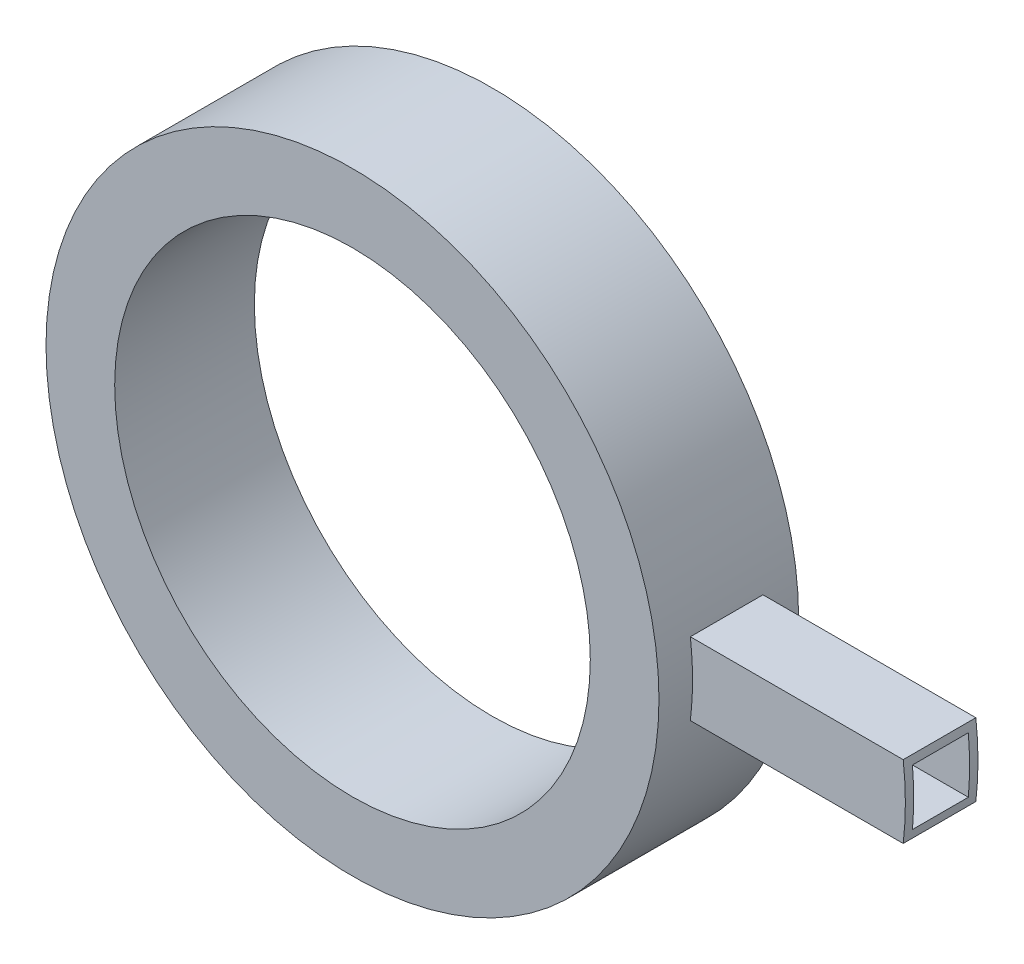
ISO-10303-21;
HEADER;
FILE_DESCRIPTION(('STEP AP214'),'2;1');
FILE_NAME('part.step','',(''),(''),'','','');
FILE_SCHEMA(('AUTOMOTIVE_DESIGN { 1 0 10303 214 1 1 1 1 }'));
ENDSEC;
DATA;
#1=APPLICATION_CONTEXT('core data for automotive mechanical design processes');
#2=APPLICATION_PROTOCOL_DEFINITION('international standard','automotive_design',2000,#1);
#3=PRODUCT_CONTEXT('',#1,'mechanical');
#4=PRODUCT('Part','Part','',(#3));
#5=PRODUCT_RELATED_PRODUCT_CATEGORY('part','',(#4));
#6=PRODUCT_DEFINITION_FORMATION('','',#4);
#7=PRODUCT_DEFINITION_CONTEXT('part definition',#1,'design');
#8=PRODUCT_DEFINITION('design','',#6,#7);
#9=PRODUCT_DEFINITION_SHAPE('','',#8);
#10=(LENGTH_UNIT() NAMED_UNIT(*) SI_UNIT(.MILLI.,.METRE.));
#11=(NAMED_UNIT(*) PLANE_ANGLE_UNIT() SI_UNIT($,.RADIAN.));
#12=(NAMED_UNIT(*) SI_UNIT($,.STERADIAN.) SOLID_ANGLE_UNIT());
#13=UNCERTAINTY_MEASURE_WITH_UNIT(LENGTH_MEASURE(1.E-05),#10,'distance_accuracy_value','');
#14=(GEOMETRIC_REPRESENTATION_CONTEXT(3) GLOBAL_UNCERTAINTY_ASSIGNED_CONTEXT((#13)) GLOBAL_UNIT_ASSIGNED_CONTEXT((#10,
#11,#12)) REPRESENTATION_CONTEXT('',''));
#15=CARTESIAN_POINT('',(0.,0.,0.));
#16=DIRECTION('',(0.,0.,1.));
#17=DIRECTION('',(1.,0.,0.));
#18=AXIS2_PLACEMENT_3D('',#15,#16,#17);
#19=CARTESIAN_POINT('',(0.,0.,50.));
#20=DIRECTION('',(0.,0.,1.));
#21=DIRECTION('',(1.,0.,0.));
#22=AXIS2_PLACEMENT_3D('',#19,#20,#21);
#23=PLANE('',#22);
#24=CARTESIAN_POINT('',(0.,0.,50.));
#25=DIRECTION('',(0.,0.,1.));
#26=DIRECTION('',(1.,0.,0.));
#27=AXIS2_PLACEMENT_3D('',#24,#25,#26);
#28=CIRCLE('',#27,109.714317710566);
#29=CARTESIAN_POINT('',(109.714317710566,0.,50.));
#30=VERTEX_POINT('',#29);
#31=EDGE_CURVE('E11',#30,#30,#28,.T.);
#32=ORIENTED_EDGE('',*,*,#31,.T.);
#33=EDGE_LOOP('',(#32));
#34=FACE_BOUND('',#33,.T.);
#35=CARTESIAN_POINT('',(0.,0.,50.));
#36=DIRECTION('',(0.,0.,1.));
#37=DIRECTION('',(1.,0.,0.));
#38=AXIS2_PLACEMENT_3D('',#35,#36,#37);
#39=CIRCLE('',#38,85.130943159236);
#40=CARTESIAN_POINT('',(85.130943159236,0.,50.));
#41=VERTEX_POINT('',#40);
#42=EDGE_CURVE('E167',#41,#41,#39,.T.);
#43=ORIENTED_EDGE('',*,*,#42,.F.);
#44=EDGE_LOOP('',(#43));
#45=FACE_BOUND('',#44,.T.);
#46=ADVANCED_FACE('F33',(#34,#45),#23,.T.);
#47=CARTESIAN_POINT('',(0.,0.,0.));
#48=DIRECTION('',(0.,0.,1.));
#49=DIRECTION('',(1.,0.,0.));
#50=AXIS2_PLACEMENT_3D('',#47,#48,#49);
#51=PLANE('',#50);
#52=CARTESIAN_POINT('',(0.,0.,0.));
#53=DIRECTION('',(0.,0.,1.));
#54=DIRECTION('',(1.,0.,0.));
#55=AXIS2_PLACEMENT_3D('',#52,#53,#54);
#56=CIRCLE('',#55,109.714317710566);
#57=CARTESIAN_POINT('',(109.714317710566,0.,0.));
#58=VERTEX_POINT('',#57);
#59=EDGE_CURVE('E37',#58,#58,#56,.T.);
#60=ORIENTED_EDGE('',*,*,#59,.F.);
#61=EDGE_LOOP('',(#60));
#62=FACE_BOUND('',#61,.T.);
#63=CARTESIAN_POINT('',(0.,0.,0.));
#64=DIRECTION('',(0.,0.,1.));
#65=DIRECTION('',(1.,0.,0.));
#66=AXIS2_PLACEMENT_3D('',#63,#64,#65);
#67=CIRCLE('',#66,85.130943159236);
#68=CARTESIAN_POINT('',(85.130943159236,0.,0.));
#69=VERTEX_POINT('',#68);
#70=EDGE_CURVE('E141',#69,#69,#67,.T.);
#71=ORIENTED_EDGE('',*,*,#70,.T.);
#72=EDGE_LOOP('',(#71));
#73=FACE_BOUND('',#72,.T.);
#74=ADVANCED_FACE('F173',(#62,#73),#51,.F.);
#75=CARTESIAN_POINT('',(0.,0.,50.));
#76=DIRECTION('',(0.,0.,-1.));
#77=DIRECTION('',(-1.,0.,0.));
#78=AXIS2_PLACEMENT_3D('',#75,#76,#77);
#79=CYLINDRICAL_SURFACE('',#78,109.714317710566);
#80=DIRECTION('',(0.,0.,-1.));
#81=VECTOR('',#80,1.);
#82=CARTESIAN_POINT('',(108.94141320313,-13.,50.));
#83=LINE('',#82,#81);
#84=CARTESIAN_POINT('',(108.94141320313,-13.,38.));
#85=VERTEX_POINT('',#84);
#86=CARTESIAN_POINT('',(108.94141320313,-13.,12.));
#87=VERTEX_POINT('',#86);
#88=EDGE_CURVE('E48',#85,#87,#83,.T.);
#89=ORIENTED_EDGE('',*,*,#88,.F.);
#90=CARTESIAN_POINT('',(0.,0.,38.));
#91=DIRECTION('',(0.,0.,-1.));
#92=DIRECTION('',(-1.,0.,0.));
#93=AXIS2_PLACEMENT_3D('',#90,#91,#92);
#94=CIRCLE('',#93,109.714317710566);
#95=CARTESIAN_POINT('',(108.94141320313,13.,38.));
#96=VERTEX_POINT('',#95);
#97=EDGE_CURVE('E149',#96,#85,#94,.T.);
#98=ORIENTED_EDGE('',*,*,#97,.F.);
#99=DIRECTION('',(0.,0.,-1.));
#100=VECTOR('',#99,1.);
#101=CARTESIAN_POINT('',(108.94141320313,13.,50.));
#102=LINE('',#101,#100);
#103=CARTESIAN_POINT('',(108.94141320313,13.,12.));
#104=VERTEX_POINT('',#103);
#105=EDGE_CURVE('E139',#96,#104,#102,.T.);
#106=ORIENTED_EDGE('',*,*,#105,.T.);
#107=CARTESIAN_POINT('',(0.,0.,12.));
#108=DIRECTION('',(0.,0.,1.));
#109=DIRECTION('',(1.,0.,0.));
#110=AXIS2_PLACEMENT_3D('',#107,#108,#109);
#111=CIRCLE('',#110,109.714317710566);
#112=EDGE_CURVE('E53',#87,#104,#111,.T.);
#113=ORIENTED_EDGE('',*,*,#112,.F.);
#114=EDGE_LOOP('',(#89,#98,#106,#113));
#115=FACE_BOUND('',#114,.T.);
#116=ORIENTED_EDGE('',*,*,#31,.F.);
#117=EDGE_LOOP('',(#116));
#118=FACE_BOUND('',#117,.T.);
#119=ORIENTED_EDGE('',*,*,#59,.T.);
#120=EDGE_LOOP('',(#119));
#121=FACE_BOUND('',#120,.T.);
#122=ADVANCED_FACE('F35',(#115,#118,#121),#79,.T.);
#123=CARTESIAN_POINT('',(0.,0.,50.));
#124=DIRECTION('',(0.,0.,-1.));
#125=DIRECTION('',(-1.,0.,0.));
#126=AXIS2_PLACEMENT_3D('',#123,#124,#125);
#127=CYLINDRICAL_SURFACE('',#126,85.130943159236);
#128=ORIENTED_EDGE('',*,*,#42,.T.);
#129=EDGE_LOOP('',(#128));
#130=FACE_BOUND('',#129,.T.);
#131=ORIENTED_EDGE('',*,*,#70,.F.);
#132=EDGE_LOOP('',(#131));
#133=FACE_BOUND('',#132,.T.);
#134=ADVANCED_FACE('F175',(#130,#133),#127,.F.);
#135=CARTESIAN_POINT('',(76.2,0.,50.));
#136=DIRECTION('',(0.,0.,-1.));
#137=DIRECTION('',(-1.,0.,0.));
#138=AXIS2_PLACEMENT_3D('',#135,#136,#137);
#139=CYLINDRICAL_SURFACE('',#138,109.714317710566);
#140=DIRECTION('',(0.,0.,-1.));
#141=VECTOR('',#140,1.);
#142=CARTESIAN_POINT('',(185.45763822587,-10.,50.));
#143=LINE('',#142,#141);
#144=CARTESIAN_POINT('',(185.45763822587,-9.99999999999996,35.));
#145=VERTEX_POINT('',#144);
#146=CARTESIAN_POINT('',(185.45763822587,-10.,15.));
#147=VERTEX_POINT('',#146);
#148=EDGE_CURVE('E127',#145,#147,#143,.T.);
#149=ORIENTED_EDGE('',*,*,#148,.F.);
#150=CARTESIAN_POINT('',(76.2,0.,35.));
#151=DIRECTION('',(0.,0.,-1.));
#152=DIRECTION('',(-1.,0.,0.));
#153=AXIS2_PLACEMENT_3D('',#150,#151,#152);
#154=CIRCLE('',#153,109.714317710566);
#155=CARTESIAN_POINT('',(185.45763822587,10.,35.));
#156=VERTEX_POINT('',#155);
#157=EDGE_CURVE('E133',#156,#145,#154,.T.);
#158=ORIENTED_EDGE('',*,*,#157,.F.);
#159=DIRECTION('',(0.,0.,-1.));
#160=VECTOR('',#159,1.);
#161=CARTESIAN_POINT('',(185.45763822587,10.,50.));
#162=LINE('',#161,#160);
#163=CARTESIAN_POINT('',(185.45763822587,10.,15.));
#164=VERTEX_POINT('',#163);
#165=EDGE_CURVE('E108',#156,#164,#162,.T.);
#166=ORIENTED_EDGE('',*,*,#165,.T.);
#167=CARTESIAN_POINT('',(76.2,0.,15.));
#168=DIRECTION('',(0.,0.,1.));
#169=DIRECTION('',(1.,0.,0.));
#170=AXIS2_PLACEMENT_3D('',#167,#168,#169);
#171=CIRCLE('',#170,109.714317710566);
#172=EDGE_CURVE('E116',#147,#164,#171,.T.);
#173=ORIENTED_EDGE('',*,*,#172,.F.);
#174=EDGE_LOOP('',(#149,#158,#166,#173));
#175=FACE_BOUND('',#174,.T.);
#176=DIRECTION('',(0.,0.,-1.));
#177=VECTOR('',#176,1.);
#178=CARTESIAN_POINT('',(185.14141320313,13.,50.));
#179=LINE('',#178,#177);
#180=CARTESIAN_POINT('',(185.14141320313,13.,38.));
#181=VERTEX_POINT('',#180);
#182=CARTESIAN_POINT('',(185.14141320313,13.,12.));
#183=VERTEX_POINT('',#182);
#184=EDGE_CURVE('E142',#181,#183,#179,.T.);
#185=ORIENTED_EDGE('',*,*,#184,.F.);
#186=CARTESIAN_POINT('',(76.2,0.,38.));
#187=DIRECTION('',(0.,0.,-1.));
#188=DIRECTION('',(-1.,0.,0.));
#189=AXIS2_PLACEMENT_3D('',#186,#187,#188);
#190=CIRCLE('',#189,109.714317710566);
#191=CARTESIAN_POINT('',(185.14141320313,-13.,38.));
#192=VERTEX_POINT('',#191);
#193=EDGE_CURVE('E107',#181,#192,#190,.T.);
#194=ORIENTED_EDGE('',*,*,#193,.T.);
#195=DIRECTION('',(0.,0.,-1.));
#196=VECTOR('',#195,1.);
#197=CARTESIAN_POINT('',(185.14141320313,-13.,50.));
#198=LINE('',#197,#196);
#199=CARTESIAN_POINT('',(185.14141320313,-13.,12.));
#200=VERTEX_POINT('',#199);
#201=EDGE_CURVE('E148',#192,#200,#198,.T.);
#202=ORIENTED_EDGE('',*,*,#201,.T.);
#203=CARTESIAN_POINT('',(76.2,0.,12.));
#204=DIRECTION('',(0.,0.,1.));
#205=DIRECTION('',(1.,0.,0.));
#206=AXIS2_PLACEMENT_3D('',#203,#204,#205);
#207=CIRCLE('',#206,109.714317710566);
#208=EDGE_CURVE('E145',#200,#183,#207,.T.);
#209=ORIENTED_EDGE('',*,*,#208,.T.);
#210=EDGE_LOOP('',(#185,#194,#202,#209));
#211=FACE_BOUND('',#210,.T.);
#212=ADVANCED_FACE('F177',(#175,#211),#139,.T.);
#213=CARTESIAN_POINT('',(108.94141320313,-13.,38.));
#214=DIRECTION('',(0.,0.,1.));
#215=DIRECTION('',(1.,0.,0.));
#216=AXIS2_PLACEMENT_3D('',#213,#214,#215);
#217=PLANE('',#216);
#218=ORIENTED_EDGE('',*,*,#193,.F.);
#219=DIRECTION('',(1.,0.,0.));
#220=VECTOR('',#219,1.);
#221=CARTESIAN_POINT('',(108.94141320313,13.,38.));
#222=LINE('',#221,#220);
#223=EDGE_CURVE('E153',#96,#181,#222,.T.);
#224=ORIENTED_EDGE('',*,*,#223,.F.);
#225=ORIENTED_EDGE('',*,*,#97,.T.);
#226=DIRECTION('',(1.,0.,0.));
#227=VECTOR('',#226,1.);
#228=CARTESIAN_POINT('',(108.94141320313,-13.,38.));
#229=LINE('',#228,#227);
#230=EDGE_CURVE('E152',#85,#192,#229,.T.);
#231=ORIENTED_EDGE('',*,*,#230,.T.);
#232=EDGE_LOOP('',(#218,#224,#225,#231));
#233=FACE_BOUND('',#232,.T.);
#234=ADVANCED_FACE('F185',(#233),#217,.T.);
#235=CARTESIAN_POINT('',(108.94141320313,-13.,50.));
#236=DIRECTION('',(0.,-1.,0.));
#237=DIRECTION('',(0.,0.,-1.));
#238=AXIS2_PLACEMENT_3D('',#235,#236,#237);
#239=PLANE('',#238);
#240=ORIENTED_EDGE('',*,*,#201,.F.);
#241=ORIENTED_EDGE('',*,*,#230,.F.);
#242=ORIENTED_EDGE('',*,*,#88,.T.);
#243=DIRECTION('',(1.,0.,0.));
#244=VECTOR('',#243,1.);
#245=CARTESIAN_POINT('',(108.94141320313,-13.,12.));
#246=LINE('',#245,#244);
#247=EDGE_CURVE('E147',#87,#200,#246,.T.);
#248=ORIENTED_EDGE('',*,*,#247,.T.);
#249=EDGE_LOOP('',(#240,#241,#242,#248));
#250=FACE_BOUND('',#249,.T.);
#251=ADVANCED_FACE('F231',(#250),#239,.T.);
#252=CARTESIAN_POINT('',(108.94141320313,13.,12.));
#253=DIRECTION('',(0.,0.,-1.));
#254=DIRECTION('',(-1.,0.,0.));
#255=AXIS2_PLACEMENT_3D('',#252,#253,#254);
#256=PLANE('',#255);
#257=ORIENTED_EDGE('',*,*,#208,.F.);
#258=ORIENTED_EDGE('',*,*,#247,.F.);
#259=ORIENTED_EDGE('',*,*,#112,.T.);
#260=DIRECTION('',(1.,0.,0.));
#261=VECTOR('',#260,1.);
#262=CARTESIAN_POINT('',(108.94141320313,13.,12.));
#263=LINE('',#262,#261);
#264=EDGE_CURVE('E144',#104,#183,#263,.T.);
#265=ORIENTED_EDGE('',*,*,#264,.T.);
#266=EDGE_LOOP('',(#257,#258,#259,#265));
#267=FACE_BOUND('',#266,.T.);
#268=ADVANCED_FACE('F191',(#267),#256,.T.);
#269=CARTESIAN_POINT('',(108.94141320313,13.,50.));
#270=DIRECTION('',(0.,-1.,0.));
#271=DIRECTION('',(0.,0.,-1.));
#272=AXIS2_PLACEMENT_3D('',#269,#270,#271);
#273=PLANE('',#272);
#274=ORIENTED_EDGE('',*,*,#184,.T.);
#275=ORIENTED_EDGE('',*,*,#264,.F.);
#276=ORIENTED_EDGE('',*,*,#105,.F.);
#277=ORIENTED_EDGE('',*,*,#223,.T.);
#278=EDGE_LOOP('',(#274,#275,#276,#277));
#279=FACE_BOUND('',#278,.T.);
#280=ADVANCED_FACE('F180',(#279),#273,.F.);
#281=CARTESIAN_POINT('',(109.25763822587,-10.,35.));
#282=DIRECTION('',(0.,0.,1.));
#283=DIRECTION('',(1.,0.,0.));
#284=AXIS2_PLACEMENT_3D('',#281,#282,#283);
#285=PLANE('',#284);
#286=ORIENTED_EDGE('',*,*,#157,.T.);
#287=DIRECTION('',(1.,0.,0.));
#288=VECTOR('',#287,1.);
#289=CARTESIAN_POINT('',(109.25763822587,-10.,35.));
#290=LINE('',#289,#288);
#291=CARTESIAN_POINT('',(109.25763822587,-9.99999999999996,35.));
#292=VERTEX_POINT('',#291);
#293=EDGE_CURVE('E130',#292,#145,#290,.T.);
#294=ORIENTED_EDGE('',*,*,#293,.F.);
#295=CARTESIAN_POINT('',(0.,0.,35.));
#296=DIRECTION('',(0.,0.,-1.));
#297=DIRECTION('',(-1.,0.,0.));
#298=AXIS2_PLACEMENT_3D('',#295,#296,#297);
#299=CIRCLE('',#298,109.714317710566);
#300=CARTESIAN_POINT('',(109.25763822587,10.,35.));
#301=VERTEX_POINT('',#300);
#302=EDGE_CURVE('E128',#301,#292,#299,.T.);
#303=ORIENTED_EDGE('',*,*,#302,.F.);
#304=DIRECTION('',(1.,0.,0.));
#305=VECTOR('',#304,1.);
#306=CARTESIAN_POINT('',(109.25763822587,10.,35.));
#307=LINE('',#306,#305);
#308=EDGE_CURVE('E103',#301,#156,#307,.T.);
#309=ORIENTED_EDGE('',*,*,#308,.T.);
#310=EDGE_LOOP('',(#286,#294,#303,#309));
#311=FACE_BOUND('',#310,.T.);
#312=ADVANCED_FACE('F190',(#311),#285,.F.);
#313=CARTESIAN_POINT('',(109.25763822587,-10.,50.));
#314=DIRECTION('',(0.,-1.,0.));
#315=DIRECTION('',(0.,0.,-1.));
#316=AXIS2_PLACEMENT_3D('',#313,#314,#315);
#317=PLANE('',#316);
#318=ORIENTED_EDGE('',*,*,#148,.T.);
#319=DIRECTION('',(1.,0.,0.));
#320=VECTOR('',#319,1.);
#321=CARTESIAN_POINT('',(109.25763822587,-10.0000000000001,15.));
#322=LINE('',#321,#320);
#323=CARTESIAN_POINT('',(109.25763822587,-10.,15.));
#324=VERTEX_POINT('',#323);
#325=EDGE_CURVE('E123',#324,#147,#322,.T.);
#326=ORIENTED_EDGE('',*,*,#325,.F.);
#327=DIRECTION('',(0.,0.,-1.));
#328=VECTOR('',#327,1.);
#329=CARTESIAN_POINT('',(109.25763822587,-10.,50.));
#330=LINE('',#329,#328);
#331=EDGE_CURVE('E121',#292,#324,#330,.T.);
#332=ORIENTED_EDGE('',*,*,#331,.F.);
#333=ORIENTED_EDGE('',*,*,#293,.T.);
#334=EDGE_LOOP('',(#318,#326,#332,#333));
#335=FACE_BOUND('',#334,.T.);
#336=ADVANCED_FACE('F265',(#335),#317,.F.);
#337=CARTESIAN_POINT('',(109.25763822587,10.,15.));
#338=DIRECTION('',(0.,0.,-1.));
#339=DIRECTION('',(-1.,0.,0.));
#340=AXIS2_PLACEMENT_3D('',#337,#338,#339);
#341=PLANE('',#340);
#342=ORIENTED_EDGE('',*,*,#172,.T.);
#343=DIRECTION('',(1.,0.,0.));
#344=VECTOR('',#343,1.);
#345=CARTESIAN_POINT('',(109.25763822587,10.,15.));
#346=LINE('',#345,#344);
#347=CARTESIAN_POINT('',(109.25763822587,10.,15.));
#348=VERTEX_POINT('',#347);
#349=EDGE_CURVE('E100',#348,#164,#346,.T.);
#350=ORIENTED_EDGE('',*,*,#349,.F.);
#351=CARTESIAN_POINT('',(0.,0.,15.));
#352=DIRECTION('',(0.,0.,1.));
#353=DIRECTION('',(1.,0.,0.));
#354=AXIS2_PLACEMENT_3D('',#351,#352,#353);
#355=CIRCLE('',#354,109.714317710566);
#356=EDGE_CURVE('E113',#324,#348,#355,.T.);
#357=ORIENTED_EDGE('',*,*,#356,.F.);
#358=ORIENTED_EDGE('',*,*,#325,.T.);
#359=EDGE_LOOP('',(#342,#350,#357,#358));
#360=FACE_BOUND('',#359,.T.);
#361=ADVANCED_FACE('F111',(#360),#341,.F.);
#362=CARTESIAN_POINT('',(109.25763822587,10.,50.));
#363=DIRECTION('',(0.,-1.,0.));
#364=DIRECTION('',(0.,0.,-1.));
#365=AXIS2_PLACEMENT_3D('',#362,#363,#364);
#366=PLANE('',#365);
#367=ORIENTED_EDGE('',*,*,#165,.F.);
#368=ORIENTED_EDGE('',*,*,#308,.F.);
#369=DIRECTION('',(0.,0.,-1.));
#370=VECTOR('',#369,1.);
#371=CARTESIAN_POINT('',(109.25763822587,10.,50.));
#372=LINE('',#371,#370);
#373=EDGE_CURVE('E97',#301,#348,#372,.T.);
#374=ORIENTED_EDGE('',*,*,#373,.T.);
#375=ORIENTED_EDGE('',*,*,#349,.T.);
#376=EDGE_LOOP('',(#367,#368,#374,#375));
#377=FACE_BOUND('',#376,.T.);
#378=ADVANCED_FACE('F99',(#377),#366,.T.);
#379=ORIENTED_EDGE('',*,*,#302,.T.);
#380=ORIENTED_EDGE('',*,*,#331,.T.);
#381=ORIENTED_EDGE('',*,*,#356,.T.);
#382=ORIENTED_EDGE('',*,*,#373,.F.);
#383=EDGE_LOOP('',(#379,#380,#381,#382));
#384=FACE_BOUND('',#383,.T.);
#385=ADVANCED_FACE('F120',(#384),#79,.T.);
#386=CLOSED_SHELL('',(#46,#74,#122,#134,#212,#234,#251,#268,#280,#312,#336,#361,#378,#385));
#387=MANIFOLD_SOLID_BREP('B2',#386);
#388=ADVANCED_BREP_SHAPE_REPRESENTATION('',(#18,#387),#14);
#389=SHAPE_DEFINITION_REPRESENTATION(#9,#388);
ENDSEC;
END-ISO-10303-21;
